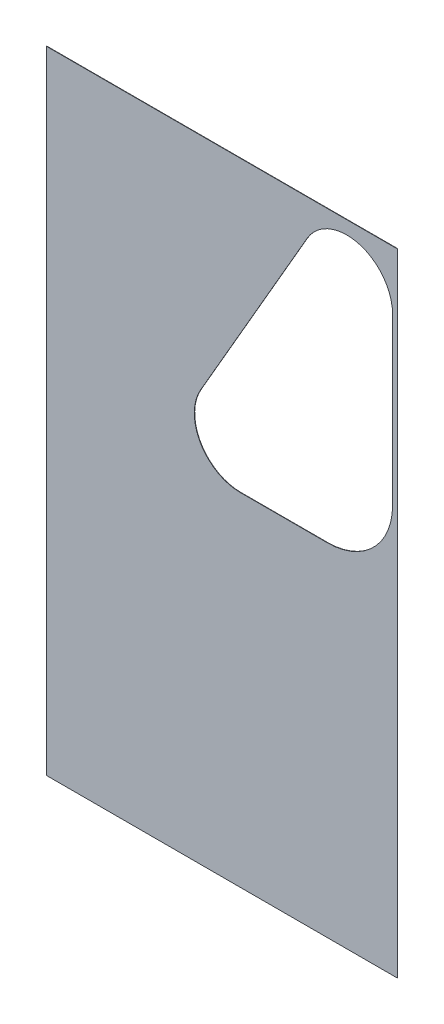
ISO-10303-21;
HEADER;
FILE_DESCRIPTION(('STEP AP214'),'2;1');
FILE_NAME('part.step','',(''),(''),'','','');
FILE_SCHEMA(('AUTOMOTIVE_DESIGN { 1 0 10303 214 1 1 1 1 }'));
ENDSEC;
DATA;
#1=APPLICATION_CONTEXT('core data for automotive mechanical design processes');
#2=APPLICATION_PROTOCOL_DEFINITION('international standard','automotive_design',2000,#1);
#3=PRODUCT_CONTEXT('',#1,'mechanical');
#4=PRODUCT('Part','Part','',(#3));
#5=PRODUCT_RELATED_PRODUCT_CATEGORY('part','',(#4));
#6=PRODUCT_DEFINITION_FORMATION('','',#4);
#7=PRODUCT_DEFINITION_CONTEXT('part definition',#1,'design');
#8=PRODUCT_DEFINITION('design','',#6,#7);
#9=PRODUCT_DEFINITION_SHAPE('','',#8);
#10=(LENGTH_UNIT() NAMED_UNIT(*) SI_UNIT(.MILLI.,.METRE.));
#11=(NAMED_UNIT(*) PLANE_ANGLE_UNIT() SI_UNIT($,.RADIAN.));
#12=(NAMED_UNIT(*) SI_UNIT($,.STERADIAN.) SOLID_ANGLE_UNIT());
#13=UNCERTAINTY_MEASURE_WITH_UNIT(LENGTH_MEASURE(1.E-05),#10,'distance_accuracy_value','');
#14=(GEOMETRIC_REPRESENTATION_CONTEXT(3) GLOBAL_UNCERTAINTY_ASSIGNED_CONTEXT((#13)) GLOBAL_UNIT_ASSIGNED_CONTEXT((#10,
#11,#12)) REPRESENTATION_CONTEXT('',''));
#15=CARTESIAN_POINT('',(0.,0.,0.));
#16=DIRECTION('',(0.,0.,1.));
#17=DIRECTION('',(1.,0.,0.));
#18=AXIS2_PLACEMENT_3D('',#15,#16,#17);
#19=CARTESIAN_POINT('',(0.,0.,1.));
#20=DIRECTION('',(1.,0.,0.));
#21=DIRECTION('',(0.,1.,0.));
#22=AXIS2_PLACEMENT_3D('',#19,#20,#21);
#23=PLANE('',#22);
#24=DIRECTION('',(0.,-1.,0.));
#25=VECTOR('',#24,1.);
#26=CARTESIAN_POINT('',(0.,0.,0.));
#27=LINE('',#26,#25);
#28=CARTESIAN_POINT('',(-4.44089209850063E-13,1625.,0.));
#29=VERTEX_POINT('',#28);
#30=CARTESIAN_POINT('',(0.,0.,0.));
#31=VERTEX_POINT('',#30);
#32=EDGE_CURVE('E153',#29,#31,#27,.T.);
#33=ORIENTED_EDGE('',*,*,#32,.T.);
#34=DIRECTION('',(0.,0.,-1.));
#35=VECTOR('',#34,1.);
#36=CARTESIAN_POINT('',(0.,0.,1.));
#37=LINE('',#36,#35);
#38=CARTESIAN_POINT('',(0.,0.,1.));
#39=VERTEX_POINT('',#38);
#40=EDGE_CURVE('E11',#39,#31,#37,.T.);
#41=ORIENTED_EDGE('',*,*,#40,.F.);
#42=DIRECTION('',(0.,-1.,0.));
#43=VECTOR('',#42,1.);
#44=CARTESIAN_POINT('',(0.,0.,1.));
#45=LINE('',#44,#43);
#46=CARTESIAN_POINT('',(-4.44089209850063E-13,1625.,1.));
#47=VERTEX_POINT('',#46);
#48=EDGE_CURVE('E161',#47,#39,#45,.T.);
#49=ORIENTED_EDGE('',*,*,#48,.F.);
#50=DIRECTION('',(0.,0.,-1.));
#51=VECTOR('',#50,1.);
#52=CARTESIAN_POINT('',(-4.44089209850063E-13,1625.,1.));
#53=LINE('',#52,#51);
#54=EDGE_CURVE('E171',#47,#29,#53,.T.);
#55=ORIENTED_EDGE('',*,*,#54,.T.);
#56=EDGE_LOOP('',(#33,#41,#49,#55));
#57=FACE_BOUND('',#56,.T.);
#58=ADVANCED_FACE('F32',(#57),#23,.F.);
#59=CARTESIAN_POINT('',(0.,0.,1.));
#60=DIRECTION('',(0.,1.,0.));
#61=DIRECTION('',(0.,0.,1.));
#62=AXIS2_PLACEMENT_3D('',#59,#60,#61);
#63=PLANE('',#62);
#64=DIRECTION('',(1.,0.,0.));
#65=VECTOR('',#64,1.);
#66=CARTESIAN_POINT('',(0.,0.,0.));
#67=LINE('',#66,#65);
#68=CARTESIAN_POINT('',(903.,0.,0.));
#69=VERTEX_POINT('',#68);
#70=EDGE_CURVE('E174',#31,#69,#67,.T.);
#71=ORIENTED_EDGE('',*,*,#70,.T.);
#72=DIRECTION('',(0.,0.,-1.));
#73=VECTOR('',#72,1.);
#74=CARTESIAN_POINT('',(903.,0.,1.));
#75=LINE('',#74,#73);
#76=CARTESIAN_POINT('',(903.,0.,1.));
#77=VERTEX_POINT('',#76);
#78=EDGE_CURVE('E39',#77,#69,#75,.T.);
#79=ORIENTED_EDGE('',*,*,#78,.F.);
#80=DIRECTION('',(1.,0.,0.));
#81=VECTOR('',#80,1.);
#82=CARTESIAN_POINT('',(0.,0.,1.));
#83=LINE('',#82,#81);
#84=EDGE_CURVE('E164',#39,#77,#83,.T.);
#85=ORIENTED_EDGE('',*,*,#84,.F.);
#86=ORIENTED_EDGE('',*,*,#40,.T.);
#87=EDGE_LOOP('',(#71,#79,#85,#86));
#88=FACE_BOUND('',#87,.T.);
#89=ADVANCED_FACE('F202',(#88),#63,.F.);
#90=CARTESIAN_POINT('',(903.,0.,1.));
#91=DIRECTION('',(-1.,0.,0.));
#92=DIRECTION('',(0.,-1.,0.));
#93=AXIS2_PLACEMENT_3D('',#90,#91,#92);
#94=PLANE('',#93);
#95=DIRECTION('',(0.,1.,0.));
#96=VECTOR('',#95,1.);
#97=CARTESIAN_POINT('',(903.,0.,0.));
#98=LINE('',#97,#96);
#99=CARTESIAN_POINT('',(903.,1625.,0.));
#100=VERTEX_POINT('',#99);
#101=EDGE_CURVE('E176',#69,#100,#98,.T.);
#102=ORIENTED_EDGE('',*,*,#101,.T.);
#103=DIRECTION('',(0.,0.,-1.));
#104=VECTOR('',#103,1.);
#105=CARTESIAN_POINT('',(903.,1625.,1.));
#106=LINE('',#105,#104);
#107=CARTESIAN_POINT('',(903.,1625.,1.));
#108=VERTEX_POINT('',#107);
#109=EDGE_CURVE('E181',#108,#100,#106,.T.);
#110=ORIENTED_EDGE('',*,*,#109,.F.);
#111=DIRECTION('',(0.,1.,0.));
#112=VECTOR('',#111,1.);
#113=CARTESIAN_POINT('',(903.,0.,1.));
#114=LINE('',#113,#112);
#115=EDGE_CURVE('E167',#77,#108,#114,.T.);
#116=ORIENTED_EDGE('',*,*,#115,.F.);
#117=ORIENTED_EDGE('',*,*,#78,.T.);
#118=EDGE_LOOP('',(#102,#110,#116,#117));
#119=FACE_BOUND('',#118,.T.);
#120=ADVANCED_FACE('F188',(#119),#94,.F.);
#121=CARTESIAN_POINT('',(-4.44089209850063E-13,1625.,1.));
#122=DIRECTION('',(0.,-1.,0.));
#123=DIRECTION('',(0.,0.,-1.));
#124=AXIS2_PLACEMENT_3D('',#121,#122,#123);
#125=PLANE('',#124);
#126=DIRECTION('',(-1.,0.,0.));
#127=VECTOR('',#126,1.);
#128=CARTESIAN_POINT('',(-4.44089209850063E-13,1625.,0.));
#129=LINE('',#128,#127);
#130=EDGE_CURVE('E165',#100,#29,#129,.T.);
#131=ORIENTED_EDGE('',*,*,#130,.T.);
#132=ORIENTED_EDGE('',*,*,#54,.F.);
#133=DIRECTION('',(-1.,0.,0.));
#134=VECTOR('',#133,1.);
#135=CARTESIAN_POINT('',(-4.44089209850063E-13,1625.,1.));
#136=LINE('',#135,#134);
#137=EDGE_CURVE('E169',#108,#47,#136,.T.);
#138=ORIENTED_EDGE('',*,*,#137,.F.);
#139=ORIENTED_EDGE('',*,*,#109,.T.);
#140=EDGE_LOOP('',(#131,#132,#138,#139));
#141=FACE_BOUND('',#140,.T.);
#142=ADVANCED_FACE('F195',(#141),#125,.F.);
#143=CARTESIAN_POINT('',(0.,0.,1.));
#144=DIRECTION('',(0.,0.,-1.));
#145=DIRECTION('',(-1.,0.,0.));
#146=AXIS2_PLACEMENT_3D('',#143,#144,#145);
#147=PLANE('',#146);
#148=DIRECTION('',(0.,1.,0.));
#149=VECTOR('',#148,1.);
#150=CARTESIAN_POINT('',(891.,1473.,0.99999999999989));
#151=LINE('',#150,#149);
#152=CARTESIAN_POINT('',(891.,1048.,1.));
#153=VERTEX_POINT('',#152);
#154=CARTESIAN_POINT('',(891.,1473.,0.99999999999989));
#155=VERTEX_POINT('',#154);
#156=EDGE_CURVE('E141',#153,#155,#151,.T.);
#157=ORIENTED_EDGE('',*,*,#156,.F.);
#158=CARTESIAN_POINT('',(723.,1048.,0.99999999999989));
#159=DIRECTION('',(0.,0.,1.));
#160=DIRECTION('',(-1.,0.,0.));
#161=AXIS2_PLACEMENT_3D('',#158,#159,#160);
#162=CIRCLE('',#161,168.);
#163=CARTESIAN_POINT('',(723.,880.,0.99999999999989));
#164=VERTEX_POINT('',#163);
#165=EDGE_CURVE('E46',#164,#153,#162,.T.);
#166=ORIENTED_EDGE('',*,*,#165,.F.);
#167=DIRECTION('',(1.,0.,0.));
#168=VECTOR('',#167,1.);
#169=CARTESIAN_POINT('',(723.,880.,0.99999999999989));
#170=LINE('',#169,#168);
#171=CARTESIAN_POINT('',(498.758622134924,880.,0.99999999999989));
#172=VERTEX_POINT('',#171);
#173=EDGE_CURVE('E127',#172,#164,#170,.T.);
#174=ORIENTED_EDGE('',*,*,#173,.F.);
#175=CARTESIAN_POINT('',(498.758622134924,998.,0.99999999999989));
#176=DIRECTION('',(0.,0.,1.));
#177=DIRECTION('',(-1.,0.,0.));
#178=AXIS2_PLACEMENT_3D('',#175,#176,#177);
#179=CIRCLE('',#178,118.);
#180=CARTESIAN_POINT('',(396.567624488361,1057.,0.99999999999989));
#181=VERTEX_POINT('',#180);
#182=EDGE_CURVE('E130',#181,#172,#179,.T.);
#183=ORIENTED_EDGE('',*,*,#182,.F.);
#184=DIRECTION('',(-0.500000000000004,-0.866025403784436,0.));
#185=VECTOR('',#184,1.);
#186=CARTESIAN_POINT('',(396.567624488361,1057.,0.99999999999989));
#187=LINE('',#186,#185);
#188=CARTESIAN_POINT('',(670.809002353436,1532.,0.99999999999989));
#189=VERTEX_POINT('',#188);
#190=EDGE_CURVE('E146',#189,#181,#187,.T.);
#191=ORIENTED_EDGE('',*,*,#190,.F.);
#192=CARTESIAN_POINT('',(773.,1473.,0.99999999999989));
#193=DIRECTION('',(0.,0.,1.));
#194=DIRECTION('',(1.,0.,0.));
#195=AXIS2_PLACEMENT_3D('',#192,#193,#194);
#196=CIRCLE('',#195,118.);
#197=EDGE_CURVE('E143',#155,#189,#196,.T.);
#198=ORIENTED_EDGE('',*,*,#197,.F.);
#199=EDGE_LOOP('',(#157,#166,#174,#183,#191,#198));
#200=FACE_BOUND('',#199,.T.);
#201=ORIENTED_EDGE('',*,*,#48,.T.);
#202=ORIENTED_EDGE('',*,*,#84,.T.);
#203=ORIENTED_EDGE('',*,*,#115,.T.);
#204=ORIENTED_EDGE('',*,*,#137,.T.);
#205=EDGE_LOOP('',(#201,#202,#203,#204));
#206=FACE_BOUND('',#205,.T.);
#207=ADVANCED_FACE('F201',(#200,#206),#147,.F.);
#208=CARTESIAN_POINT('',(0.,0.,0.));
#209=DIRECTION('',(0.,0.,-1.));
#210=DIRECTION('',(-1.,0.,0.));
#211=AXIS2_PLACEMENT_3D('',#208,#209,#210);
#212=PLANE('',#211);
#213=CARTESIAN_POINT('',(723.,1048.,0.));
#214=DIRECTION('',(0.,0.,1.));
#215=DIRECTION('',(-1.,0.,0.));
#216=AXIS2_PLACEMENT_3D('',#213,#214,#215);
#217=CIRCLE('',#216,168.);
#218=CARTESIAN_POINT('',(723.,880.,0.));
#219=VERTEX_POINT('',#218);
#220=CARTESIAN_POINT('',(891.,1048.,0.));
#221=VERTEX_POINT('',#220);
#222=EDGE_CURVE('E110',#219,#221,#217,.T.);
#223=ORIENTED_EDGE('',*,*,#222,.T.);
#224=DIRECTION('',(0.,1.,0.));
#225=VECTOR('',#224,1.);
#226=CARTESIAN_POINT('',(891.,1473.,0.));
#227=LINE('',#226,#225);
#228=CARTESIAN_POINT('',(891.,1473.,0.));
#229=VERTEX_POINT('',#228);
#230=EDGE_CURVE('E119',#221,#229,#227,.T.);
#231=ORIENTED_EDGE('',*,*,#230,.T.);
#232=CARTESIAN_POINT('',(773.,1473.,0.));
#233=DIRECTION('',(0.,0.,1.));
#234=DIRECTION('',(1.,0.,0.));
#235=AXIS2_PLACEMENT_3D('',#232,#233,#234);
#236=CIRCLE('',#235,118.);
#237=CARTESIAN_POINT('',(670.809002353436,1532.,0.));
#238=VERTEX_POINT('',#237);
#239=EDGE_CURVE('E54',#229,#238,#236,.T.);
#240=ORIENTED_EDGE('',*,*,#239,.T.);
#241=DIRECTION('',(-0.500000000000004,-0.866025403784436,0.));
#242=VECTOR('',#241,1.);
#243=CARTESIAN_POINT('',(396.567624488361,1057.,0.));
#244=LINE('',#243,#242);
#245=CARTESIAN_POINT('',(396.567624488361,1057.,0.));
#246=VERTEX_POINT('',#245);
#247=EDGE_CURVE('E134',#238,#246,#244,.T.);
#248=ORIENTED_EDGE('',*,*,#247,.T.);
#249=CARTESIAN_POINT('',(498.758622134924,998.,0.));
#250=DIRECTION('',(0.,0.,1.));
#251=DIRECTION('',(-1.,0.,0.));
#252=AXIS2_PLACEMENT_3D('',#249,#250,#251);
#253=CIRCLE('',#252,118.);
#254=CARTESIAN_POINT('',(498.758622134924,880.,0.));
#255=VERTEX_POINT('',#254);
#256=EDGE_CURVE('E137',#246,#255,#253,.T.);
#257=ORIENTED_EDGE('',*,*,#256,.T.);
#258=DIRECTION('',(1.,0.,0.));
#259=VECTOR('',#258,1.);
#260=CARTESIAN_POINT('',(723.,880.,0.));
#261=LINE('',#260,#259);
#262=EDGE_CURVE('E116',#255,#219,#261,.T.);
#263=ORIENTED_EDGE('',*,*,#262,.T.);
#264=EDGE_LOOP('',(#223,#231,#240,#248,#257,#263));
#265=FACE_BOUND('',#264,.T.);
#266=ORIENTED_EDGE('',*,*,#32,.F.);
#267=ORIENTED_EDGE('',*,*,#130,.F.);
#268=ORIENTED_EDGE('',*,*,#101,.F.);
#269=ORIENTED_EDGE('',*,*,#70,.F.);
#270=EDGE_LOOP('',(#266,#267,#268,#269));
#271=FACE_BOUND('',#270,.T.);
#272=ADVANCED_FACE('F123',(#265,#271),#212,.T.);
#273=CARTESIAN_POINT('',(723.,1048.,0.));
#274=DIRECTION('',(0.,0.,1.));
#275=DIRECTION('',(1.,0.,0.));
#276=AXIS2_PLACEMENT_3D('',#273,#274,#275);
#277=CYLINDRICAL_SURFACE('',#276,168.);
#278=ORIENTED_EDGE('',*,*,#165,.T.);
#279=DIRECTION('',(0.,0.,1.));
#280=VECTOR('',#279,1.);
#281=CARTESIAN_POINT('',(891.,1048.,0.));
#282=LINE('',#281,#280);
#283=EDGE_CURVE('E106',#221,#153,#282,.T.);
#284=ORIENTED_EDGE('',*,*,#283,.F.);
#285=ORIENTED_EDGE('',*,*,#222,.F.);
#286=DIRECTION('',(0.,0.,1.));
#287=VECTOR('',#286,1.);
#288=CARTESIAN_POINT('',(723.,880.,0.));
#289=LINE('',#288,#287);
#290=EDGE_CURVE('E151',#219,#164,#289,.T.);
#291=ORIENTED_EDGE('',*,*,#290,.T.);
#292=EDGE_LOOP('',(#278,#284,#285,#291));
#293=FACE_BOUND('',#292,.T.);
#294=ADVANCED_FACE('F108',(#293),#277,.F.);
#295=CARTESIAN_POINT('',(723.,880.,0.));
#296=DIRECTION('',(0.,-1.,0.));
#297=DIRECTION('',(0.,0.,-1.));
#298=AXIS2_PLACEMENT_3D('',#295,#296,#297);
#299=PLANE('',#298);
#300=ORIENTED_EDGE('',*,*,#173,.T.);
#301=ORIENTED_EDGE('',*,*,#290,.F.);
#302=ORIENTED_EDGE('',*,*,#262,.F.);
#303=DIRECTION('',(0.,0.,1.));
#304=VECTOR('',#303,1.);
#305=CARTESIAN_POINT('',(498.758622134924,880.,0.));
#306=LINE('',#305,#304);
#307=EDGE_CURVE('E154',#255,#172,#306,.T.);
#308=ORIENTED_EDGE('',*,*,#307,.T.);
#309=EDGE_LOOP('',(#300,#301,#302,#308));
#310=FACE_BOUND('',#309,.T.);
#311=ADVANCED_FACE('F219',(#310),#299,.F.);
#312=CARTESIAN_POINT('',(498.758622134924,998.,0.));
#313=DIRECTION('',(0.,0.,1.));
#314=DIRECTION('',(1.,0.,0.));
#315=AXIS2_PLACEMENT_3D('',#312,#313,#314);
#316=CYLINDRICAL_SURFACE('',#315,118.);
#317=ORIENTED_EDGE('',*,*,#182,.T.);
#318=ORIENTED_EDGE('',*,*,#307,.F.);
#319=ORIENTED_EDGE('',*,*,#256,.F.);
#320=DIRECTION('',(0.,0.,1.));
#321=VECTOR('',#320,1.);
#322=CARTESIAN_POINT('',(396.567624488361,1057.,0.));
#323=LINE('',#322,#321);
#324=EDGE_CURVE('E156',#246,#181,#323,.T.);
#325=ORIENTED_EDGE('',*,*,#324,.T.);
#326=EDGE_LOOP('',(#317,#318,#319,#325));
#327=FACE_BOUND('',#326,.T.);
#328=ADVANCED_FACE('F228',(#327),#316,.F.);
#329=CARTESIAN_POINT('',(396.567624488361,1057.,0.));
#330=DIRECTION('',(-0.866025403784436,0.500000000000004,0.));
#331=DIRECTION('',(-0.500000000000004,-0.866025403784436,0.));
#332=AXIS2_PLACEMENT_3D('',#329,#330,#331);
#333=PLANE('',#332);
#334=ORIENTED_EDGE('',*,*,#190,.T.);
#335=ORIENTED_EDGE('',*,*,#324,.F.);
#336=ORIENTED_EDGE('',*,*,#247,.F.);
#337=DIRECTION('',(0.,0.,1.));
#338=VECTOR('',#337,1.);
#339=CARTESIAN_POINT('',(670.809002353436,1532.,0.));
#340=LINE('',#339,#338);
#341=EDGE_CURVE('E158',#238,#189,#340,.T.);
#342=ORIENTED_EDGE('',*,*,#341,.T.);
#343=EDGE_LOOP('',(#334,#335,#336,#342));
#344=FACE_BOUND('',#343,.T.);
#345=ADVANCED_FACE('F225',(#344),#333,.F.);
#346=CARTESIAN_POINT('',(773.,1473.,0.));
#347=DIRECTION('',(0.,0.,1.));
#348=DIRECTION('',(1.,0.,0.));
#349=AXIS2_PLACEMENT_3D('',#346,#347,#348);
#350=CYLINDRICAL_SURFACE('',#349,118.);
#351=ORIENTED_EDGE('',*,*,#197,.T.);
#352=ORIENTED_EDGE('',*,*,#341,.F.);
#353=ORIENTED_EDGE('',*,*,#239,.F.);
#354=DIRECTION('',(0.,0.,1.));
#355=VECTOR('',#354,1.);
#356=CARTESIAN_POINT('',(891.,1473.,0.));
#357=LINE('',#356,#355);
#358=EDGE_CURVE('E115',#229,#155,#357,.T.);
#359=ORIENTED_EDGE('',*,*,#358,.T.);
#360=EDGE_LOOP('',(#351,#352,#353,#359));
#361=FACE_BOUND('',#360,.T.);
#362=ADVANCED_FACE('F222',(#361),#350,.F.);
#363=CARTESIAN_POINT('',(891.,1473.,0.));
#364=DIRECTION('',(1.,0.,0.));
#365=DIRECTION('',(0.,0.,-1.));
#366=AXIS2_PLACEMENT_3D('',#363,#364,#365);
#367=PLANE('',#366);
#368=ORIENTED_EDGE('',*,*,#156,.T.);
#369=ORIENTED_EDGE('',*,*,#358,.F.);
#370=ORIENTED_EDGE('',*,*,#230,.F.);
#371=ORIENTED_EDGE('',*,*,#283,.T.);
#372=EDGE_LOOP('',(#368,#369,#370,#371));
#373=FACE_BOUND('',#372,.T.);
#374=ADVANCED_FACE('F120',(#373),#367,.F.);
#375=CLOSED_SHELL('',(#58,#89,#120,#142,#207,#272,#294,#311,#328,#345,#362,#374));
#376=MANIFOLD_SOLID_BREP('B2',#375);
#377=ADVANCED_BREP_SHAPE_REPRESENTATION('',(#18,#376),#14);
#378=SHAPE_DEFINITION_REPRESENTATION(#9,#377);
ENDSEC;
END-ISO-10303-21;
